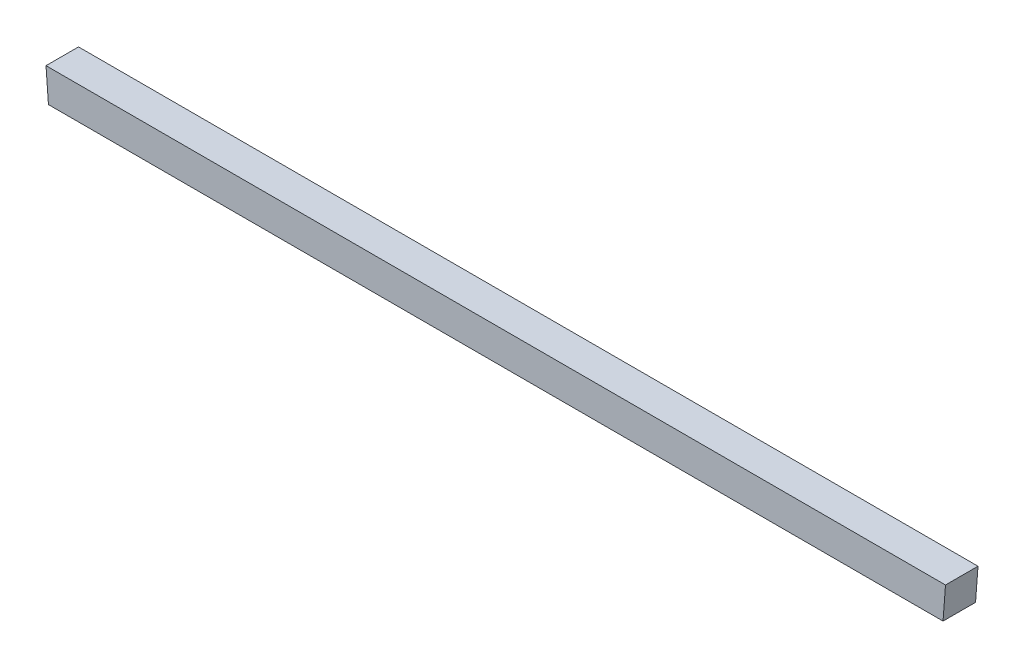
ISO-10303-21;
HEADER;
FILE_DESCRIPTION(('STEP AP214'),'2;1');
FILE_NAME('part.step','',(''),(''),'','','');
FILE_SCHEMA(('AUTOMOTIVE_DESIGN { 1 0 10303 214 1 1 1 1 }'));
ENDSEC;
DATA;
#1=APPLICATION_CONTEXT('core data for automotive mechanical design processes');
#2=APPLICATION_PROTOCOL_DEFINITION('international standard','automotive_design',2000,#1);
#3=PRODUCT_CONTEXT('',#1,'mechanical');
#4=PRODUCT('Part','Part','',(#3));
#5=PRODUCT_RELATED_PRODUCT_CATEGORY('part','',(#4));
#6=PRODUCT_DEFINITION_FORMATION('','',#4);
#7=PRODUCT_DEFINITION_CONTEXT('part definition',#1,'design');
#8=PRODUCT_DEFINITION('design','',#6,#7);
#9=PRODUCT_DEFINITION_SHAPE('','',#8);
#10=(LENGTH_UNIT() NAMED_UNIT(*) SI_UNIT(.MILLI.,.METRE.));
#11=(NAMED_UNIT(*) PLANE_ANGLE_UNIT() SI_UNIT($,.RADIAN.));
#12=(NAMED_UNIT(*) SI_UNIT($,.STERADIAN.) SOLID_ANGLE_UNIT());
#13=UNCERTAINTY_MEASURE_WITH_UNIT(LENGTH_MEASURE(1.E-05),#10,'distance_accuracy_value','');
#14=(GEOMETRIC_REPRESENTATION_CONTEXT(3) GLOBAL_UNCERTAINTY_ASSIGNED_CONTEXT((#13)) GLOBAL_UNIT_ASSIGNED_CONTEXT((#10,
#11,#12)) REPRESENTATION_CONTEXT('',''));
#15=CARTESIAN_POINT('',(0.,0.,0.));
#16=DIRECTION('',(0.,0.,1.));
#17=DIRECTION('',(1.,0.,0.));
#18=AXIS2_PLACEMENT_3D('',#15,#16,#17);
#19=CARTESIAN_POINT('',(1.94289029309402E-13,149.999999999999,-150.));
#20=DIRECTION('',(0.,-1.,0.));
#21=DIRECTION('',(0.,0.,-0.999999999999997));
#22=AXIS2_PLACEMENT_3D('',#19,#20,#21);
#23=PLANE('',#22);
#24=DIRECTION('',(0.,0.,0.999999999999997));
#25=VECTOR('',#24,1.);
#26=CARTESIAN_POINT('',(-4150.,150.,-149.999999999996));
#27=LINE('',#26,#25);
#28=CARTESIAN_POINT('',(-4150.,150.,-149.999999999996));
#29=VERTEX_POINT('',#28);
#30=CARTESIAN_POINT('',(-4150.,149.999999999999,150.000000000003));
#31=VERTEX_POINT('',#30);
#32=EDGE_CURVE('E43',#29,#31,#27,.T.);
#33=ORIENTED_EDGE('',*,*,#32,.T.);
#34=DIRECTION('',(0.999999999999999,0.,0.));
#35=VECTOR('',#34,1.);
#36=CARTESIAN_POINT('',(0.,149.999999999999,150.));
#37=LINE('',#36,#35);
#38=CARTESIAN_POINT('',(4149.99999999999,150.000000000001,150.000000000002));
#39=VERTEX_POINT('',#38);
#40=EDGE_CURVE('E83',#31,#39,#37,.T.);
#41=ORIENTED_EDGE('',*,*,#40,.T.);
#42=DIRECTION('',(0.,0.,0.999999999999997));
#43=VECTOR('',#42,1.);
#44=CARTESIAN_POINT('',(4150.,150.,-150.000000000004));
#45=LINE('',#44,#43);
#46=CARTESIAN_POINT('',(4150.,150.,-150.000000000004));
#47=VERTEX_POINT('',#46);
#48=EDGE_CURVE('E11',#47,#39,#45,.T.);
#49=ORIENTED_EDGE('',*,*,#48,.F.);
#50=DIRECTION('',(0.999999999999999,0.,0.));
#51=VECTOR('',#50,1.);
#52=CARTESIAN_POINT('',(1.94289029309402E-13,149.999999999999,-150.));
#53=LINE('',#52,#51);
#54=EDGE_CURVE('E85',#29,#47,#53,.T.);
#55=ORIENTED_EDGE('',*,*,#54,.F.);
#56=EDGE_LOOP('',(#33,#41,#49,#55));
#57=FACE_BOUND('',#56,.T.);
#58=ADVANCED_FACE('F40',(#57),#23,.F.);
#59=CARTESIAN_POINT('',(4115.59975139838,-308.669981354877,-150.000000000001));
#60=DIRECTION('',(-0.997199309888456,0.0747899482416338,0.));
#61=DIRECTION('',(-0.0747899482416339,-0.997199309888456,0.));
#62=AXIS2_PLACEMENT_3D('',#59,#60,#61);
#63=PLANE('',#62);
#64=ORIENTED_EDGE('',*,*,#48,.T.);
#65=DIRECTION('',(-0.074789948241634,-0.997199309888457,0.));
#66=VECTOR('',#65,1.);
#67=CARTESIAN_POINT('',(4115.59975139838,-308.669981354877,150.));
#68=LINE('',#67,#66);
#69=CARTESIAN_POINT('',(4127.5,-150.,150.));
#70=VERTEX_POINT('',#69);
#71=EDGE_CURVE('E102',#39,#70,#68,.T.);
#72=ORIENTED_EDGE('',*,*,#71,.T.);
#73=DIRECTION('',(0.,0.,0.999999999999997));
#74=VECTOR('',#73,1.);
#75=CARTESIAN_POINT('',(4127.5,-150.,-150.000000000001));
#76=LINE('',#75,#74);
#77=CARTESIAN_POINT('',(4127.5,-150.,-150.000000000001));
#78=VERTEX_POINT('',#77);
#79=EDGE_CURVE('E49',#78,#70,#76,.T.);
#80=ORIENTED_EDGE('',*,*,#79,.F.);
#81=DIRECTION('',(-0.074789948241634,-0.997199309888457,0.));
#82=VECTOR('',#81,1.);
#83=CARTESIAN_POINT('',(4115.59975139838,-308.669981354877,-150.000000000001));
#84=LINE('',#83,#82);
#85=EDGE_CURVE('E56',#47,#78,#84,.T.);
#86=ORIENTED_EDGE('',*,*,#85,.F.);
#87=EDGE_LOOP('',(#64,#72,#80,#86));
#88=FACE_BOUND('',#87,.T.);
#89=ADVANCED_FACE('F137',(#88),#63,.F.);
#90=CARTESIAN_POINT('',(0.,-150.,-149.999999999999));
#91=DIRECTION('',(0.,-1.,0.));
#92=DIRECTION('',(0.,0.,-0.999999999999997));
#93=AXIS2_PLACEMENT_3D('',#90,#91,#92);
#94=PLANE('',#93);
#95=ORIENTED_EDGE('',*,*,#79,.T.);
#96=DIRECTION('',(0.999999999999999,0.,0.));
#97=VECTOR('',#96,1.);
#98=CARTESIAN_POINT('',(-1.35308431126191E-13,-150.,150.));
#99=LINE('',#98,#97);
#100=CARTESIAN_POINT('',(-4127.5,-150.,150.000000000001));
#101=VERTEX_POINT('',#100);
#102=EDGE_CURVE('E98',#101,#70,#99,.T.);
#103=ORIENTED_EDGE('',*,*,#102,.F.);
#104=DIRECTION('',(0.,0.,0.999999999999997));
#105=VECTOR('',#104,1.);
#106=CARTESIAN_POINT('',(-4127.5,-150.,-150.));
#107=LINE('',#106,#105);
#108=CARTESIAN_POINT('',(-4127.5,-150.,-150.));
#109=VERTEX_POINT('',#108);
#110=EDGE_CURVE('E90',#109,#101,#107,.T.);
#111=ORIENTED_EDGE('',*,*,#110,.F.);
#112=DIRECTION('',(0.999999999999999,0.,0.));
#113=VECTOR('',#112,1.);
#114=CARTESIAN_POINT('',(0.,-150.,-149.999999999999));
#115=LINE('',#114,#113);
#116=EDGE_CURVE('E116',#109,#78,#115,.T.);
#117=ORIENTED_EDGE('',*,*,#116,.T.);
#118=EDGE_LOOP('',(#95,#103,#111,#117));
#119=FACE_BOUND('',#118,.T.);
#120=ADVANCED_FACE('F136',(#119),#94,.T.);
#121=CARTESIAN_POINT('',(-4115.59975139838,-308.669981354877,-149.999999999995));
#122=DIRECTION('',(-0.997199309888456,-0.0747899482416341,0.));
#123=DIRECTION('',(0.0747899482416339,-0.997199309888456,0.));
#124=AXIS2_PLACEMENT_3D('',#121,#122,#123);
#125=PLANE('',#124);
#126=ORIENTED_EDGE('',*,*,#110,.T.);
#127=DIRECTION('',(0.0747899482416339,-0.997199309888456,0.));
#128=VECTOR('',#127,1.);
#129=CARTESIAN_POINT('',(-4115.59975139838,-308.669981354878,150.000000000001));
#130=LINE('',#129,#128);
#131=EDGE_CURVE('E92',#31,#101,#130,.T.);
#132=ORIENTED_EDGE('',*,*,#131,.F.);
#133=ORIENTED_EDGE('',*,*,#32,.F.);
#134=DIRECTION('',(0.0747899482416339,-0.997199309888456,0.));
#135=VECTOR('',#134,1.);
#136=CARTESIAN_POINT('',(-4115.59975139838,-308.669981354877,-149.999999999995));
#137=LINE('',#136,#135);
#138=EDGE_CURVE('E113',#29,#109,#137,.T.);
#139=ORIENTED_EDGE('',*,*,#138,.T.);
#140=EDGE_LOOP('',(#126,#132,#133,#139));
#141=FACE_BOUND('',#140,.T.);
#142=ADVANCED_FACE('F93',(#141),#125,.T.);
#143=CARTESIAN_POINT('',(2.4980018054066E-13,0.,-149.999999999999));
#144=DIRECTION('',(0.,0.,0.999999999999997));
#145=DIRECTION('',(0.999999999999999,0.,0.));
#146=AXIS2_PLACEMENT_3D('',#143,#144,#145);
#147=PLANE('',#146);
#148=ORIENTED_EDGE('',*,*,#54,.T.);
#149=ORIENTED_EDGE('',*,*,#85,.T.);
#150=ORIENTED_EDGE('',*,*,#116,.F.);
#151=ORIENTED_EDGE('',*,*,#138,.F.);
#152=EDGE_LOOP('',(#148,#149,#150,#151));
#153=FACE_BOUND('',#152,.T.);
#154=ADVANCED_FACE('F146',(#153),#147,.F.);
#155=CARTESIAN_POINT('',(0.,0.,150.));
#156=DIRECTION('',(0.,0.,0.999999999999997));
#157=DIRECTION('',(0.999999999999999,0.,0.));
#158=AXIS2_PLACEMENT_3D('',#155,#156,#157);
#159=PLANE('',#158);
#160=ORIENTED_EDGE('',*,*,#40,.F.);
#161=ORIENTED_EDGE('',*,*,#131,.T.);
#162=ORIENTED_EDGE('',*,*,#102,.T.);
#163=ORIENTED_EDGE('',*,*,#71,.F.);
#164=EDGE_LOOP('',(#160,#161,#162,#163));
#165=FACE_BOUND('',#164,.T.);
#166=ADVANCED_FACE('F100',(#165),#159,.T.);
#167=CLOSED_SHELL('',(#58,#89,#120,#142,#154,#166));
#168=MANIFOLD_SOLID_BREP('B2',#167);
#169=ADVANCED_BREP_SHAPE_REPRESENTATION('',(#18,#168),#14);
#170=SHAPE_DEFINITION_REPRESENTATION(#9,#169);
ENDSEC;
END-ISO-10303-21;
